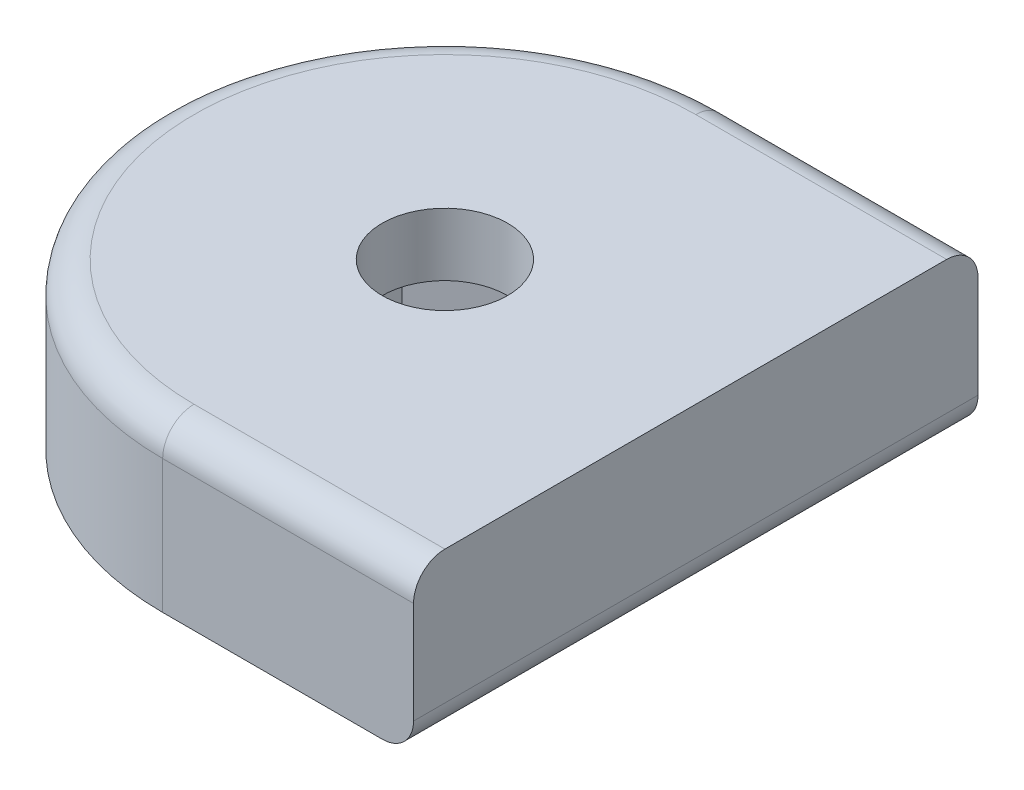
ISO-10303-21;
HEADER;
FILE_DESCRIPTION(('STEP AP214'),'2;1');
FILE_NAME('part.step','',(''),(''),'','','');
FILE_SCHEMA(('AUTOMOTIVE_DESIGN { 1 0 10303 214 1 1 1 1 }'));
ENDSEC;
DATA;
#1=APPLICATION_CONTEXT('core data for automotive mechanical design processes');
#2=APPLICATION_PROTOCOL_DEFINITION('international standard','automotive_design',2000,#1);
#3=PRODUCT_CONTEXT('',#1,'mechanical');
#4=PRODUCT('Part','Part','',(#3));
#5=PRODUCT_RELATED_PRODUCT_CATEGORY('part','',(#4));
#6=PRODUCT_DEFINITION_FORMATION('','',#4);
#7=PRODUCT_DEFINITION_CONTEXT('part definition',#1,'design');
#8=PRODUCT_DEFINITION('design','',#6,#7);
#9=PRODUCT_DEFINITION_SHAPE('','',#8);
#10=(LENGTH_UNIT() NAMED_UNIT(*) SI_UNIT(.MILLI.,.METRE.));
#11=(NAMED_UNIT(*) PLANE_ANGLE_UNIT() SI_UNIT($,.RADIAN.));
#12=(NAMED_UNIT(*) SI_UNIT($,.STERADIAN.) SOLID_ANGLE_UNIT());
#13=UNCERTAINTY_MEASURE_WITH_UNIT(LENGTH_MEASURE(1.E-05),#10,'distance_accuracy_value','');
#14=(GEOMETRIC_REPRESENTATION_CONTEXT(3) GLOBAL_UNCERTAINTY_ASSIGNED_CONTEXT((#13)) GLOBAL_UNIT_ASSIGNED_CONTEXT((#10,
#11,#12)) REPRESENTATION_CONTEXT('',''));
#15=CARTESIAN_POINT('',(0.,0.,0.));
#16=DIRECTION('',(0.,0.,1.));
#17=DIRECTION('',(1.,0.,0.));
#18=AXIS2_PLACEMENT_3D('',#15,#16,#17);
#19=CARTESIAN_POINT('',(0.,0.,0.));
#20=DIRECTION('',(0.,-1.,0.));
#21=DIRECTION('',(0.,0.,-1.));
#22=AXIS2_PLACEMENT_3D('',#19,#20,#21);
#23=PLANE('',#22);
#24=DIRECTION('',(-1.,0.,0.));
#25=VECTOR('',#24,1.);
#26=CARTESIAN_POINT('',(0.,0.,-18.));
#27=LINE('',#26,#25);
#28=CARTESIAN_POINT('',(14.,0.,-18.));
#29=VERTEX_POINT('',#28);
#30=CARTESIAN_POINT('',(0.,0.,-18.));
#31=VERTEX_POINT('',#30);
#32=EDGE_CURVE('E168',#29,#31,#27,.T.);
#33=ORIENTED_EDGE('',*,*,#32,.F.);
#34=DIRECTION('',(0.,0.,-1.));
#35=VECTOR('',#34,1.);
#36=CARTESIAN_POINT('',(14.,0.,18.));
#37=LINE('',#36,#35);
#38=CARTESIAN_POINT('',(14.,0.,18.));
#39=VERTEX_POINT('',#38);
#40=EDGE_CURVE('E11',#29,#39,#37,.F.);
#41=ORIENTED_EDGE('',*,*,#40,.T.);
#42=DIRECTION('',(1.,0.,0.));
#43=VECTOR('',#42,1.);
#44=CARTESIAN_POINT('',(16.,0.,18.));
#45=LINE('',#44,#43);
#46=CARTESIAN_POINT('',(0.,0.,18.));
#47=VERTEX_POINT('',#46);
#48=EDGE_CURVE('E159',#47,#39,#45,.T.);
#49=ORIENTED_EDGE('',*,*,#48,.F.);
#50=CARTESIAN_POINT('',(0.,0.,0.));
#51=DIRECTION('',(0.,1.,0.));
#52=DIRECTION('',(0.,0.,-1.));
#53=AXIS2_PLACEMENT_3D('',#50,#51,#52);
#54=CIRCLE('',#53,18.);
#55=EDGE_CURVE('E155',#31,#47,#54,.T.);
#56=ORIENTED_EDGE('',*,*,#55,.F.);
#57=EDGE_LOOP('',(#33,#41,#49,#56));
#58=FACE_BOUND('',#57,.T.);
#59=DIRECTION('',(0.,0.,1.));
#60=VECTOR('',#59,1.);
#61=CARTESIAN_POINT('',(-6.50000000000001,0.,-3.75277674973257));
#62=LINE('',#61,#60);
#63=CARTESIAN_POINT('',(-6.50000000000001,0.,-3.75277674973257));
#64=VERTEX_POINT('',#63);
#65=CARTESIAN_POINT('',(-6.50000000000001,0.,3.75277674973257));
#66=VERTEX_POINT('',#65);
#67=EDGE_CURVE('E150',#64,#66,#62,.T.);
#68=ORIENTED_EDGE('',*,*,#67,.T.);
#69=DIRECTION('',(0.866025403784438,0.,0.5));
#70=VECTOR('',#69,1.);
#71=CARTESIAN_POINT('',(-6.50000000000001,0.,3.75277674973257));
#72=LINE('',#71,#70);
#73=CARTESIAN_POINT('',(0.,0.,7.50555349946514));
#74=VERTEX_POINT('',#73);
#75=EDGE_CURVE('E220',#66,#74,#72,.T.);
#76=ORIENTED_EDGE('',*,*,#75,.T.);
#77=DIRECTION('',(0.866025403784439,0.,-0.5));
#78=VECTOR('',#77,1.);
#79=CARTESIAN_POINT('',(0.,0.,7.50555349946514));
#80=LINE('',#79,#78);
#81=CARTESIAN_POINT('',(6.5,0.,3.75277674973257));
#82=VERTEX_POINT('',#81);
#83=EDGE_CURVE('E154',#74,#82,#80,.T.);
#84=ORIENTED_EDGE('',*,*,#83,.T.);
#85=DIRECTION('',(0.,0.,-1.));
#86=VECTOR('',#85,1.);
#87=CARTESIAN_POINT('',(6.5,0.,3.75277674973257));
#88=LINE('',#87,#86);
#89=CARTESIAN_POINT('',(6.5,0.,-3.75277674973258));
#90=VERTEX_POINT('',#89);
#91=EDGE_CURVE('E232',#82,#90,#88,.T.);
#92=ORIENTED_EDGE('',*,*,#91,.T.);
#93=DIRECTION('',(-0.866025403784439,0.,-0.5));
#94=VECTOR('',#93,1.);
#95=CARTESIAN_POINT('',(6.5,0.,-3.75277674973258));
#96=LINE('',#95,#94);
#97=CARTESIAN_POINT('',(0.,0.,-7.50555349946515));
#98=VERTEX_POINT('',#97);
#99=EDGE_CURVE('E235',#90,#98,#96,.T.);
#100=ORIENTED_EDGE('',*,*,#99,.T.);
#101=DIRECTION('',(-0.866025403784439,0.,0.5));
#102=VECTOR('',#101,1.);
#103=CARTESIAN_POINT('',(0.,0.,-7.50555349946515));
#104=LINE('',#103,#102);
#105=EDGE_CURVE('E238',#98,#64,#104,.T.);
#106=ORIENTED_EDGE('',*,*,#105,.T.);
#107=EDGE_LOOP('',(#68,#76,#84,#92,#100,#106));
#108=FACE_BOUND('',#107,.T.);
#109=ADVANCED_FACE('F33',(#58,#108),#23,.T.);
#110=CARTESIAN_POINT('',(0.,10.5,0.));
#111=DIRECTION('',(0.,-1.,0.));
#112=DIRECTION('',(0.,0.,-1.));
#113=AXIS2_PLACEMENT_3D('',#110,#111,#112);
#114=CYLINDRICAL_SURFACE('',#113,18.);
#115=DIRECTION('',(0.,-1.,0.));
#116=VECTOR('',#115,1.);
#117=CARTESIAN_POINT('',(0.,10.5,18.));
#118=LINE('',#117,#116);
#119=CARTESIAN_POINT('',(0.,8.5,18.));
#120=VERTEX_POINT('',#119);
#121=EDGE_CURVE('E180',#120,#47,#118,.T.);
#122=ORIENTED_EDGE('',*,*,#121,.F.);
#123=CARTESIAN_POINT('',(0.,8.5,0.));
#124=DIRECTION('',(0.,-1.,0.));
#125=DIRECTION('',(0.,0.,-1.));
#126=AXIS2_PLACEMENT_3D('',#123,#124,#125);
#127=CIRCLE('',#126,18.);
#128=CARTESIAN_POINT('',(0.,8.5,-18.));
#129=VERTEX_POINT('',#128);
#130=EDGE_CURVE('E42',#120,#129,#127,.T.);
#131=ORIENTED_EDGE('',*,*,#130,.T.);
#132=DIRECTION('',(0.,-1.,0.));
#133=VECTOR('',#132,1.);
#134=CARTESIAN_POINT('',(0.,10.5,-18.));
#135=LINE('',#134,#133);
#136=EDGE_CURVE('E167',#129,#31,#135,.T.);
#137=ORIENTED_EDGE('',*,*,#136,.T.);
#138=ORIENTED_EDGE('',*,*,#55,.T.);
#139=EDGE_LOOP('',(#122,#131,#137,#138));
#140=FACE_BOUND('',#139,.T.);
#141=ADVANCED_FACE('F273',(#140),#114,.T.);
#142=CARTESIAN_POINT('',(16.,10.5,18.));
#143=DIRECTION('',(0.,0.,-1.));
#144=DIRECTION('',(-1.,0.,0.));
#145=AXIS2_PLACEMENT_3D('',#142,#143,#144);
#146=PLANE('',#145);
#147=DIRECTION('',(0.,-1.,0.));
#148=VECTOR('',#147,1.);
#149=CARTESIAN_POINT('',(16.,10.5,18.));
#150=LINE('',#149,#148);
#151=CARTESIAN_POINT('',(16.,8.5,18.));
#152=VERTEX_POINT('',#151);
#153=CARTESIAN_POINT('',(16.,2.,18.));
#154=VERTEX_POINT('',#153);
#155=EDGE_CURVE('E177',#152,#154,#150,.T.);
#156=ORIENTED_EDGE('',*,*,#155,.F.);
#157=DIRECTION('',(1.,0.,0.));
#158=VECTOR('',#157,1.);
#159=CARTESIAN_POINT('',(16.,8.5,18.));
#160=LINE('',#159,#158);
#161=EDGE_CURVE('E50',#152,#120,#160,.F.);
#162=ORIENTED_EDGE('',*,*,#161,.T.);
#163=ORIENTED_EDGE('',*,*,#121,.T.);
#164=ORIENTED_EDGE('',*,*,#48,.T.);
#165=CARTESIAN_POINT('',(14.,2.,18.));
#166=DIRECTION('',(0.,0.,-1.));
#167=DIRECTION('',(-1.,0.,0.));
#168=AXIS2_PLACEMENT_3D('',#165,#166,#167);
#169=CIRCLE('',#168,2.);
#170=EDGE_CURVE('E200',#39,#154,#169,.F.);
#171=ORIENTED_EDGE('',*,*,#170,.T.);
#172=EDGE_LOOP('',(#156,#162,#163,#164,#171));
#173=FACE_BOUND('',#172,.T.);
#174=ADVANCED_FACE('F278',(#173),#146,.F.);
#175=CARTESIAN_POINT('',(16.,10.5,-18.));
#176=DIRECTION('',(-1.,0.,0.));
#177=DIRECTION('',(0.,0.,1.));
#178=AXIS2_PLACEMENT_3D('',#175,#176,#177);
#179=PLANE('',#178);
#180=DIRECTION('',(0.,-1.,0.));
#181=VECTOR('',#180,1.);
#182=CARTESIAN_POINT('',(16.,10.5,-18.));
#183=LINE('',#182,#181);
#184=CARTESIAN_POINT('',(16.,8.5,-18.));
#185=VERTEX_POINT('',#184);
#186=CARTESIAN_POINT('',(16.,2.,-18.));
#187=VERTEX_POINT('',#186);
#188=EDGE_CURVE('E174',#185,#187,#183,.T.);
#189=ORIENTED_EDGE('',*,*,#188,.F.);
#190=CARTESIAN_POINT('',(16.,8.5,-16.));
#191=DIRECTION('',(-1.,0.,0.));
#192=DIRECTION('',(0.,0.,1.));
#193=AXIS2_PLACEMENT_3D('',#190,#191,#192);
#194=CIRCLE('',#193,2.);
#195=CARTESIAN_POINT('',(16.,10.5,-16.));
#196=VERTEX_POINT('',#195);
#197=EDGE_CURVE('E198',#185,#196,#194,.F.);
#198=ORIENTED_EDGE('',*,*,#197,.T.);
#199=DIRECTION('',(0.,0.,-1.));
#200=VECTOR('',#199,1.);
#201=CARTESIAN_POINT('',(16.,10.5,-18.));
#202=LINE('',#201,#200);
#203=CARTESIAN_POINT('',(16.,10.5,16.));
#204=VERTEX_POINT('',#203);
#205=EDGE_CURVE('E165',#204,#196,#202,.T.);
#206=ORIENTED_EDGE('',*,*,#205,.F.);
#207=CARTESIAN_POINT('',(16.,8.5,16.));
#208=DIRECTION('',(-1.,0.,0.));
#209=DIRECTION('',(0.,0.,1.));
#210=AXIS2_PLACEMENT_3D('',#207,#208,#209);
#211=CIRCLE('',#210,2.);
#212=EDGE_CURVE('E196',#204,#152,#211,.F.);
#213=ORIENTED_EDGE('',*,*,#212,.T.);
#214=ORIENTED_EDGE('',*,*,#155,.T.);
#215=DIRECTION('',(0.,0.,-1.));
#216=VECTOR('',#215,1.);
#217=CARTESIAN_POINT('',(16.,2.,-18.));
#218=LINE('',#217,#216);
#219=EDGE_CURVE('E193',#154,#187,#218,.T.);
#220=ORIENTED_EDGE('',*,*,#219,.T.);
#221=EDGE_LOOP('',(#189,#198,#206,#213,#214,#220));
#222=FACE_BOUND('',#221,.T.);
#223=ADVANCED_FACE('F288',(#222),#179,.F.);
#224=CARTESIAN_POINT('',(0.,10.5,-18.));
#225=DIRECTION('',(0.,0.,1.));
#226=DIRECTION('',(1.,0.,0.));
#227=AXIS2_PLACEMENT_3D('',#224,#225,#226);
#228=PLANE('',#227);
#229=ORIENTED_EDGE('',*,*,#136,.F.);
#230=DIRECTION('',(-1.,0.,0.));
#231=VECTOR('',#230,1.);
#232=CARTESIAN_POINT('',(0.,8.5,-18.));
#233=LINE('',#232,#231);
#234=EDGE_CURVE('E191',#129,#185,#233,.F.);
#235=ORIENTED_EDGE('',*,*,#234,.T.);
#236=ORIENTED_EDGE('',*,*,#188,.T.);
#237=CARTESIAN_POINT('',(14.,2.,-18.));
#238=DIRECTION('',(0.,0.,1.));
#239=DIRECTION('',(1.,0.,0.));
#240=AXIS2_PLACEMENT_3D('',#237,#238,#239);
#241=CIRCLE('',#240,2.);
#242=EDGE_CURVE('E189',#187,#29,#241,.F.);
#243=ORIENTED_EDGE('',*,*,#242,.T.);
#244=ORIENTED_EDGE('',*,*,#32,.T.);
#245=EDGE_LOOP('',(#229,#235,#236,#243,#244));
#246=FACE_BOUND('',#245,.T.);
#247=ADVANCED_FACE('F285',(#246),#228,.F.);
#248=CARTESIAN_POINT('',(0.,10.5,0.));
#249=DIRECTION('',(0.,-1.,0.));
#250=DIRECTION('',(0.,0.,-1.));
#251=AXIS2_PLACEMENT_3D('',#248,#249,#250);
#252=PLANE('',#251);
#253=ORIENTED_EDGE('',*,*,#205,.T.);
#254=DIRECTION('',(-1.,0.,0.));
#255=VECTOR('',#254,1.);
#256=CARTESIAN_POINT('',(0.,10.5,-16.));
#257=LINE('',#256,#255);
#258=CARTESIAN_POINT('',(0.,10.5,-16.));
#259=VERTEX_POINT('',#258);
#260=EDGE_CURVE('E186',#196,#259,#257,.T.);
#261=ORIENTED_EDGE('',*,*,#260,.T.);
#262=CARTESIAN_POINT('',(0.,10.5,0.));
#263=DIRECTION('',(0.,-1.,0.));
#264=DIRECTION('',(0.,0.,-1.));
#265=AXIS2_PLACEMENT_3D('',#262,#263,#264);
#266=CIRCLE('',#265,16.);
#267=CARTESIAN_POINT('',(0.,10.5,16.));
#268=VERTEX_POINT('',#267);
#269=EDGE_CURVE('E182',#259,#268,#266,.F.);
#270=ORIENTED_EDGE('',*,*,#269,.T.);
#271=DIRECTION('',(1.,0.,0.));
#272=VECTOR('',#271,1.);
#273=CARTESIAN_POINT('',(0.,10.5,16.));
#274=LINE('',#273,#272);
#275=EDGE_CURVE('E184',#268,#204,#274,.T.);
#276=ORIENTED_EDGE('',*,*,#275,.T.);
#277=EDGE_LOOP('',(#253,#261,#270,#276));
#278=FACE_BOUND('',#277,.T.);
#279=CARTESIAN_POINT('',(0.,10.5,0.));
#280=DIRECTION('',(0.,-1.,0.));
#281=DIRECTION('',(0.,0.,-1.));
#282=AXIS2_PLACEMENT_3D('',#279,#280,#281);
#283=CIRCLE('',#282,4.);
#284=CARTESIAN_POINT('',(0.,10.5,-4.));
#285=VERTEX_POINT('',#284);
#286=EDGE_CURVE('E215',#285,#285,#283,.T.);
#287=ORIENTED_EDGE('',*,*,#286,.T.);
#288=EDGE_LOOP('',(#287));
#289=FACE_BOUND('',#288,.T.);
#290=ADVANCED_FACE('F283',(#278,#289),#252,.F.);
#291=CARTESIAN_POINT('',(-6.50000000000001,6.5,3.75277674973257));
#292=DIRECTION('',(0.5,0.,-0.866025403784438));
#293=DIRECTION('',(-0.866025403784439,0.,-0.5));
#294=AXIS2_PLACEMENT_3D('',#291,#292,#293);
#295=PLANE('',#294);
#296=ORIENTED_EDGE('',*,*,#75,.F.);
#297=DIRECTION('',(0.,-1.,0.));
#298=VECTOR('',#297,1.);
#299=CARTESIAN_POINT('',(-6.50000000000001,6.5,3.75277674973257));
#300=LINE('',#299,#298);
#301=CARTESIAN_POINT('',(-6.50000000000001,6.5,3.75277674973257));
#302=VERTEX_POINT('',#301);
#303=EDGE_CURVE('E149',#302,#66,#300,.T.);
#304=ORIENTED_EDGE('',*,*,#303,.F.);
#305=DIRECTION('',(0.866025403784438,0.,0.5));
#306=VECTOR('',#305,1.);
#307=CARTESIAN_POINT('',(-6.50000000000001,6.5,3.75277674973257));
#308=LINE('',#307,#306);
#309=CARTESIAN_POINT('',(0.,6.5,7.50555349946514));
#310=VERTEX_POINT('',#309);
#311=EDGE_CURVE('E135',#302,#310,#308,.T.);
#312=ORIENTED_EDGE('',*,*,#311,.T.);
#313=DIRECTION('',(0.,-1.,0.));
#314=VECTOR('',#313,1.);
#315=CARTESIAN_POINT('',(0.,6.5,7.50555349946514));
#316=LINE('',#315,#314);
#317=EDGE_CURVE('E146',#310,#74,#316,.T.);
#318=ORIENTED_EDGE('',*,*,#317,.T.);
#319=EDGE_LOOP('',(#296,#304,#312,#318));
#320=FACE_BOUND('',#319,.T.);
#321=ADVANCED_FACE('F145',(#320),#295,.T.);
#322=CARTESIAN_POINT('',(0.,6.5,7.50555349946514));
#323=DIRECTION('',(-0.5,0.,-0.866025403784439));
#324=DIRECTION('',(-0.866025403784439,0.,0.5));
#325=AXIS2_PLACEMENT_3D('',#322,#323,#324);
#326=PLANE('',#325);
#327=ORIENTED_EDGE('',*,*,#83,.F.);
#328=ORIENTED_EDGE('',*,*,#317,.F.);
#329=DIRECTION('',(0.866025403784439,0.,-0.5));
#330=VECTOR('',#329,1.);
#331=CARTESIAN_POINT('',(0.,6.5,7.50555349946514));
#332=LINE('',#331,#330);
#333=CARTESIAN_POINT('',(6.5,6.5,3.75277674973257));
#334=VERTEX_POINT('',#333);
#335=EDGE_CURVE('E131',#310,#334,#332,.T.);
#336=ORIENTED_EDGE('',*,*,#335,.T.);
#337=DIRECTION('',(0.,-1.,0.));
#338=VECTOR('',#337,1.);
#339=CARTESIAN_POINT('',(6.5,6.5,3.75277674973257));
#340=LINE('',#339,#338);
#341=EDGE_CURVE('E156',#334,#82,#340,.T.);
#342=ORIENTED_EDGE('',*,*,#341,.T.);
#343=EDGE_LOOP('',(#327,#328,#336,#342));
#344=FACE_BOUND('',#343,.T.);
#345=ADVANCED_FACE('F152',(#344),#326,.T.);
#346=CARTESIAN_POINT('',(6.5,6.5,3.75277674973257));
#347=DIRECTION('',(-1.,0.,0.));
#348=DIRECTION('',(0.,0.,1.));
#349=AXIS2_PLACEMENT_3D('',#346,#347,#348);
#350=PLANE('',#349);
#351=ORIENTED_EDGE('',*,*,#91,.F.);
#352=ORIENTED_EDGE('',*,*,#341,.F.);
#353=DIRECTION('',(0.,0.,-1.));
#354=VECTOR('',#353,1.);
#355=CARTESIAN_POINT('',(6.5,6.5,3.75277674973257));
#356=LINE('',#355,#354);
#357=CARTESIAN_POINT('',(6.5,6.5,-3.75277674973258));
#358=VERTEX_POINT('',#357);
#359=EDGE_CURVE('E137',#334,#358,#356,.T.);
#360=ORIENTED_EDGE('',*,*,#359,.T.);
#361=DIRECTION('',(0.,-1.,0.));
#362=VECTOR('',#361,1.);
#363=CARTESIAN_POINT('',(6.5,6.5,-3.75277674973258));
#364=LINE('',#363,#362);
#365=EDGE_CURVE('E161',#358,#90,#364,.T.);
#366=ORIENTED_EDGE('',*,*,#365,.T.);
#367=EDGE_LOOP('',(#351,#352,#360,#366));
#368=FACE_BOUND('',#367,.T.);
#369=ADVANCED_FACE('F251',(#368),#350,.T.);
#370=CARTESIAN_POINT('',(6.5,6.5,-3.75277674973258));
#371=DIRECTION('',(-0.5,0.,0.866025403784439));
#372=DIRECTION('',(0.866025403784439,0.,0.5));
#373=AXIS2_PLACEMENT_3D('',#370,#371,#372);
#374=PLANE('',#373);
#375=ORIENTED_EDGE('',*,*,#99,.F.);
#376=ORIENTED_EDGE('',*,*,#365,.F.);
#377=DIRECTION('',(-0.866025403784439,0.,-0.5));
#378=VECTOR('',#377,1.);
#379=CARTESIAN_POINT('',(6.5,6.5,-3.75277674973258));
#380=LINE('',#379,#378);
#381=CARTESIAN_POINT('',(0.,6.5,-7.50555349946515));
#382=VERTEX_POINT('',#381);
#383=EDGE_CURVE('E224',#358,#382,#380,.T.);
#384=ORIENTED_EDGE('',*,*,#383,.T.);
#385=DIRECTION('',(0.,-1.,0.));
#386=VECTOR('',#385,1.);
#387=CARTESIAN_POINT('',(0.,6.5,-7.50555349946515));
#388=LINE('',#387,#386);
#389=EDGE_CURVE('E246',#382,#98,#388,.T.);
#390=ORIENTED_EDGE('',*,*,#389,.T.);
#391=EDGE_LOOP('',(#375,#376,#384,#390));
#392=FACE_BOUND('',#391,.T.);
#393=ADVANCED_FACE('F253',(#392),#374,.T.);
#394=CARTESIAN_POINT('',(0.,6.5,-7.50555349946515));
#395=DIRECTION('',(0.5,0.,0.866025403784439));
#396=DIRECTION('',(0.866025403784439,0.,-0.5));
#397=AXIS2_PLACEMENT_3D('',#394,#395,#396);
#398=PLANE('',#397);
#399=ORIENTED_EDGE('',*,*,#105,.F.);
#400=ORIENTED_EDGE('',*,*,#389,.F.);
#401=DIRECTION('',(-0.866025403784439,0.,0.5));
#402=VECTOR('',#401,1.);
#403=CARTESIAN_POINT('',(0.,6.5,-7.50555349946515));
#404=LINE('',#403,#402);
#405=CARTESIAN_POINT('',(-6.50000000000001,6.5,-3.75277674973257));
#406=VERTEX_POINT('',#405);
#407=EDGE_CURVE('E226',#382,#406,#404,.T.);
#408=ORIENTED_EDGE('',*,*,#407,.T.);
#409=DIRECTION('',(0.,-1.,0.));
#410=VECTOR('',#409,1.);
#411=CARTESIAN_POINT('',(-6.50000000000001,6.5,-3.75277674973257));
#412=LINE('',#411,#410);
#413=EDGE_CURVE('E244',#406,#64,#412,.T.);
#414=ORIENTED_EDGE('',*,*,#413,.T.);
#415=EDGE_LOOP('',(#399,#400,#408,#414));
#416=FACE_BOUND('',#415,.T.);
#417=ADVANCED_FACE('F263',(#416),#398,.T.);
#418=CARTESIAN_POINT('',(-6.50000000000001,6.5,-3.75277674973257));
#419=DIRECTION('',(1.,0.,0.));
#420=DIRECTION('',(0.,0.,-1.));
#421=AXIS2_PLACEMENT_3D('',#418,#419,#420);
#422=PLANE('',#421);
#423=ORIENTED_EDGE('',*,*,#67,.F.);
#424=ORIENTED_EDGE('',*,*,#413,.F.);
#425=DIRECTION('',(0.,0.,1.));
#426=VECTOR('',#425,1.);
#427=CARTESIAN_POINT('',(-6.50000000000001,6.5,-3.75277674973257));
#428=LINE('',#427,#426);
#429=EDGE_CURVE('E228',#406,#302,#428,.T.);
#430=ORIENTED_EDGE('',*,*,#429,.T.);
#431=ORIENTED_EDGE('',*,*,#303,.T.);
#432=EDGE_LOOP('',(#423,#424,#430,#431));
#433=FACE_BOUND('',#432,.T.);
#434=ADVANCED_FACE('F259',(#433),#422,.T.);
#435=CARTESIAN_POINT('',(0.,6.5,0.));
#436=DIRECTION('',(0.,1.,0.));
#437=DIRECTION('',(0.,0.,1.));
#438=AXIS2_PLACEMENT_3D('',#435,#436,#437);
#439=PLANE('',#438);
#440=CARTESIAN_POINT('',(0.,6.5,0.));
#441=DIRECTION('',(0.,-1.,0.));
#442=DIRECTION('',(0.,0.,-1.));
#443=AXIS2_PLACEMENT_3D('',#440,#441,#442);
#444=CIRCLE('',#443,4.);
#445=CARTESIAN_POINT('',(0.,6.5,-4.));
#446=VERTEX_POINT('',#445);
#447=EDGE_CURVE('E210',#446,#446,#444,.T.);
#448=ORIENTED_EDGE('',*,*,#447,.F.);
#449=EDGE_LOOP('',(#448));
#450=FACE_BOUND('',#449,.T.);
#451=ORIENTED_EDGE('',*,*,#311,.F.);
#452=ORIENTED_EDGE('',*,*,#429,.F.);
#453=ORIENTED_EDGE('',*,*,#407,.F.);
#454=ORIENTED_EDGE('',*,*,#383,.F.);
#455=ORIENTED_EDGE('',*,*,#359,.F.);
#456=ORIENTED_EDGE('',*,*,#335,.F.);
#457=EDGE_LOOP('',(#451,#452,#453,#454,#455,#456));
#458=FACE_BOUND('',#457,.T.);
#459=ADVANCED_FACE('F133',(#450,#458),#439,.F.);
#460=CARTESIAN_POINT('',(0.,10.5,0.));
#461=DIRECTION('',(0.,-1.,0.));
#462=DIRECTION('',(0.,0.,-1.));
#463=AXIS2_PLACEMENT_3D('',#460,#461,#462);
#464=CYLINDRICAL_SURFACE('',#463,4.);
#465=ORIENTED_EDGE('',*,*,#286,.F.);
#466=EDGE_LOOP('',(#465));
#467=FACE_BOUND('',#466,.T.);
#468=ORIENTED_EDGE('',*,*,#447,.T.);
#469=EDGE_LOOP('',(#468));
#470=FACE_BOUND('',#469,.T.);
#471=ADVANCED_FACE('F302',(#467,#470),#464,.F.);
#472=CARTESIAN_POINT('',(0.,8.5,16.));
#473=DIRECTION('',(1.,0.,0.));
#474=DIRECTION('',(0.,0.,-1.));
#475=AXIS2_PLACEMENT_3D('',#472,#473,#474);
#476=CYLINDRICAL_SURFACE('',#475,2.);
#477=ORIENTED_EDGE('',*,*,#212,.F.);
#478=ORIENTED_EDGE('',*,*,#275,.F.);
#479=CARTESIAN_POINT('',(0.,8.5,16.));
#480=DIRECTION('',(-1.,0.,0.));
#481=DIRECTION('',(0.,0.,1.));
#482=AXIS2_PLACEMENT_3D('',#479,#480,#481);
#483=CIRCLE('',#482,2.);
#484=EDGE_CURVE('E37',#120,#268,#483,.T.);
#485=ORIENTED_EDGE('',*,*,#484,.F.);
#486=ORIENTED_EDGE('',*,*,#161,.F.);
#487=EDGE_LOOP('',(#477,#478,#485,#486));
#488=FACE_BOUND('',#487,.T.);
#489=ADVANCED_FACE('F300',(#488),#476,.T.);
#490=CARTESIAN_POINT('',(0.,8.5,0.));
#491=DIRECTION('',(0.,-1.,0.));
#492=DIRECTION('',(0.,0.,-1.));
#493=AXIS2_PLACEMENT_3D('',#490,#491,#492);
#494=TOROIDAL_SURFACE('',#493,16.,2.);
#495=ORIENTED_EDGE('',*,*,#484,.T.);
#496=ORIENTED_EDGE('',*,*,#269,.F.);
#497=CARTESIAN_POINT('',(0.,8.5,-16.));
#498=DIRECTION('',(1.,0.,0.));
#499=DIRECTION('',(0.,1.,0.));
#500=AXIS2_PLACEMENT_3D('',#497,#498,#499);
#501=CIRCLE('',#500,2.);
#502=EDGE_CURVE('E203',#129,#259,#501,.T.);
#503=ORIENTED_EDGE('',*,*,#502,.F.);
#504=ORIENTED_EDGE('',*,*,#130,.F.);
#505=EDGE_LOOP('',(#495,#496,#503,#504));
#506=FACE_BOUND('',#505,.T.);
#507=ADVANCED_FACE('F298',(#506),#494,.T.);
#508=CARTESIAN_POINT('',(0.,8.5,-16.));
#509=DIRECTION('',(-1.,0.,0.));
#510=DIRECTION('',(0.,0.,1.));
#511=AXIS2_PLACEMENT_3D('',#508,#509,#510);
#512=CYLINDRICAL_SURFACE('',#511,2.);
#513=ORIENTED_EDGE('',*,*,#197,.F.);
#514=ORIENTED_EDGE('',*,*,#234,.F.);
#515=ORIENTED_EDGE('',*,*,#502,.T.);
#516=ORIENTED_EDGE('',*,*,#260,.F.);
#517=EDGE_LOOP('',(#513,#514,#515,#516));
#518=FACE_BOUND('',#517,.T.);
#519=ADVANCED_FACE('F295',(#518),#512,.T.);
#520=CARTESIAN_POINT('',(14.,2.,-18.));
#521=DIRECTION('',(0.,0.,1.));
#522=DIRECTION('',(1.,0.,0.));
#523=AXIS2_PLACEMENT_3D('',#520,#521,#522);
#524=CYLINDRICAL_SURFACE('',#523,2.);
#525=ORIENTED_EDGE('',*,*,#170,.F.);
#526=ORIENTED_EDGE('',*,*,#40,.F.);
#527=ORIENTED_EDGE('',*,*,#242,.F.);
#528=ORIENTED_EDGE('',*,*,#219,.F.);
#529=EDGE_LOOP('',(#525,#526,#527,#528));
#530=FACE_BOUND('',#529,.T.);
#531=ADVANCED_FACE('F35',(#530),#524,.T.);
#532=CLOSED_SHELL('',(#109,#141,#174,#223,#247,#290,#321,#345,#369,#393,#417,#434,#459,#471,
#489,#507,#519,#531));
#533=MANIFOLD_SOLID_BREP('B2',#532);
#534=ADVANCED_BREP_SHAPE_REPRESENTATION('',(#18,#533),#14);
#535=SHAPE_DEFINITION_REPRESENTATION(#9,#534);
ENDSEC;
END-ISO-10303-21;
